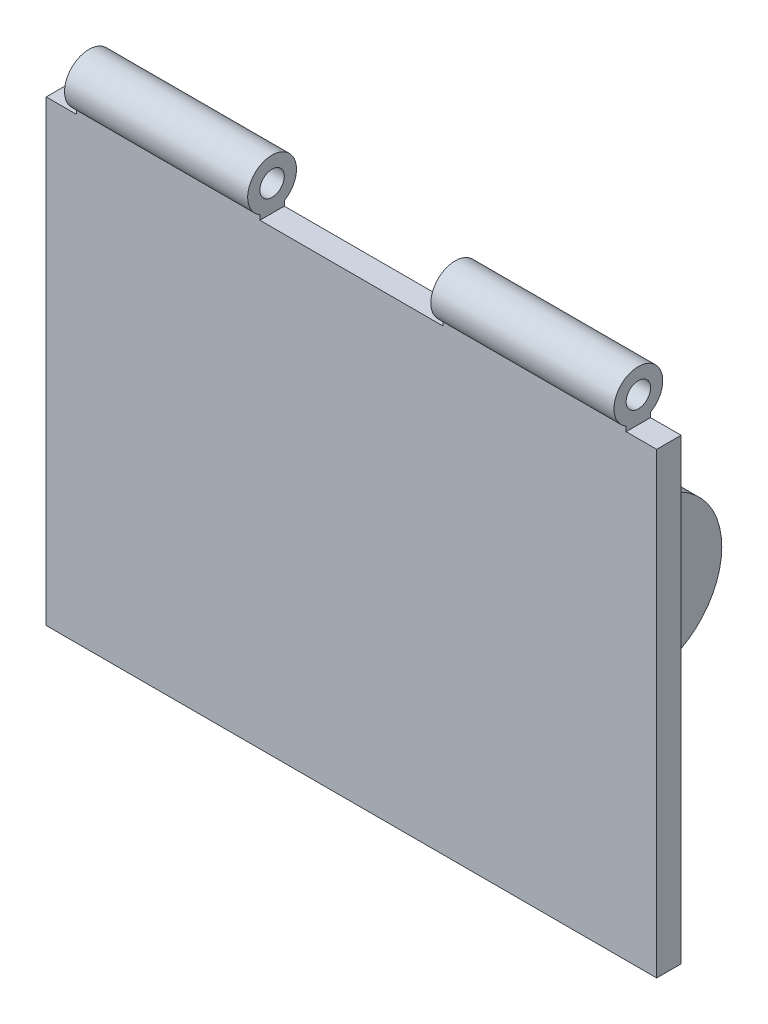
ISO-10303-21;
HEADER;
FILE_DESCRIPTION(('STEP AP214'),'2;1');
FILE_NAME('part.step','',(''),(''),'','','');
FILE_SCHEMA(('AUTOMOTIVE_DESIGN { 1 0 10303 214 1 1 1 1 }'));
ENDSEC;
DATA;
#1=APPLICATION_CONTEXT('core data for automotive mechanical design processes');
#2=APPLICATION_PROTOCOL_DEFINITION('international standard','automotive_design',2000,#1);
#3=PRODUCT_CONTEXT('',#1,'mechanical');
#4=PRODUCT('Part','Part','',(#3));
#5=PRODUCT_RELATED_PRODUCT_CATEGORY('part','',(#4));
#6=PRODUCT_DEFINITION_FORMATION('','',#4);
#7=PRODUCT_DEFINITION_CONTEXT('part definition',#1,'design');
#8=PRODUCT_DEFINITION('design','',#6,#7);
#9=PRODUCT_DEFINITION_SHAPE('','',#8);
#10=(LENGTH_UNIT() NAMED_UNIT(*) SI_UNIT(.MILLI.,.METRE.));
#11=(NAMED_UNIT(*) PLANE_ANGLE_UNIT() SI_UNIT($,.RADIAN.));
#12=(NAMED_UNIT(*) SI_UNIT($,.STERADIAN.) SOLID_ANGLE_UNIT());
#13=UNCERTAINTY_MEASURE_WITH_UNIT(LENGTH_MEASURE(1.E-05),#10,'distance_accuracy_value','');
#14=(GEOMETRIC_REPRESENTATION_CONTEXT(3) GLOBAL_UNCERTAINTY_ASSIGNED_CONTEXT((#13)) GLOBAL_UNIT_ASSIGNED_CONTEXT((#10,
#11,#12)) REPRESENTATION_CONTEXT('',''));
#15=CARTESIAN_POINT('',(0.,0.,0.));
#16=DIRECTION('',(0.,0.,1.));
#17=DIRECTION('',(1.,0.,0.));
#18=AXIS2_PLACEMENT_3D('',#15,#16,#17);
#19=CARTESIAN_POINT('',(-50.,37.5,4.));
#20=DIRECTION('',(0.,-1.,0.));
#21=DIRECTION('',(0.,0.,-1.));
#22=AXIS2_PLACEMENT_3D('',#19,#20,#21);
#23=PLANE('',#22);
#24=DIRECTION('',(0.,0.,-1.));
#25=VECTOR('',#24,1.);
#26=CARTESIAN_POINT('',(-15.,37.5,4.));
#27=LINE('',#26,#25);
#28=CARTESIAN_POINT('',(-15.,37.5,4.));
#29=VERTEX_POINT('',#28);
#30=CARTESIAN_POINT('',(-15.,37.5,0.));
#31=VERTEX_POINT('',#30);
#32=EDGE_CURVE('E206',#29,#31,#27,.T.);
#33=ORIENTED_EDGE('',*,*,#32,.F.);
#34=DIRECTION('',(-1.,0.,0.));
#35=VECTOR('',#34,1.);
#36=CARTESIAN_POINT('',(-50.,37.5,4.));
#37=LINE('',#36,#35);
#38=CARTESIAN_POINT('',(15.,37.5,4.));
#39=VERTEX_POINT('',#38);
#40=EDGE_CURVE('E249',#39,#29,#37,.T.);
#41=ORIENTED_EDGE('',*,*,#40,.F.);
#42=DIRECTION('',(0.,0.,1.));
#43=VECTOR('',#42,1.);
#44=CARTESIAN_POINT('',(15.,37.5,4.));
#45=LINE('',#44,#43);
#46=CARTESIAN_POINT('',(15.,37.5,0.));
#47=VERTEX_POINT('',#46);
#48=EDGE_CURVE('E237',#47,#39,#45,.T.);
#49=ORIENTED_EDGE('',*,*,#48,.F.);
#50=DIRECTION('',(-1.,0.,0.));
#51=VECTOR('',#50,1.);
#52=CARTESIAN_POINT('',(-50.,37.5,0.));
#53=LINE('',#52,#51);
#54=EDGE_CURVE('E261',#47,#31,#53,.T.);
#55=ORIENTED_EDGE('',*,*,#54,.T.);
#56=EDGE_LOOP('',(#33,#41,#49,#55));
#57=FACE_BOUND('',#56,.T.);
#58=ADVANCED_FACE('F38',(#57),#23,.F.);
#59=CARTESIAN_POINT('',(-45.,37.5,4.));
#60=VERTEX_POINT('',#59);
#61=CARTESIAN_POINT('',(-50.,37.5,4.));
#62=VERTEX_POINT('',#61);
#63=EDGE_CURVE('E243',#60,#62,#37,.T.);
#64=ORIENTED_EDGE('',*,*,#63,.F.);
#65=DIRECTION('',(0.,0.,-1.));
#66=VECTOR('',#65,1.);
#67=CARTESIAN_POINT('',(-45.,37.5,4.));
#68=LINE('',#67,#66);
#69=CARTESIAN_POINT('',(-45.,37.5,0.));
#70=VERTEX_POINT('',#69);
#71=EDGE_CURVE('E201',#60,#70,#68,.T.);
#72=ORIENTED_EDGE('',*,*,#71,.T.);
#73=CARTESIAN_POINT('',(-50.,37.5,0.));
#74=VERTEX_POINT('',#73);
#75=EDGE_CURVE('E256',#70,#74,#53,.T.);
#76=ORIENTED_EDGE('',*,*,#75,.T.);
#77=DIRECTION('',(0.,0.,-1.));
#78=VECTOR('',#77,1.);
#79=CARTESIAN_POINT('',(-50.,37.5,4.));
#80=LINE('',#79,#78);
#81=EDGE_CURVE('E270',#62,#74,#80,.T.);
#82=ORIENTED_EDGE('',*,*,#81,.F.);
#83=EDGE_LOOP('',(#64,#72,#76,#82));
#84=FACE_BOUND('',#83,.T.);
#85=ADVANCED_FACE('F323',(#84),#23,.F.);
#86=CARTESIAN_POINT('',(50.,-37.5,4.));
#87=DIRECTION('',(-1.,0.,0.));
#88=DIRECTION('',(0.,0.,1.));
#89=AXIS2_PLACEMENT_3D('',#86,#87,#88);
#90=PLANE('',#89);
#91=DIRECTION('',(0.,1.,0.));
#92=VECTOR('',#91,1.);
#93=CARTESIAN_POINT('',(50.,-37.5,0.));
#94=LINE('',#93,#92);
#95=CARTESIAN_POINT('',(50.,-37.5,0.));
#96=VERTEX_POINT('',#95);
#97=CARTESIAN_POINT('',(50.,37.5,0.));
#98=VERTEX_POINT('',#97);
#99=EDGE_CURVE('E239',#96,#98,#94,.T.);
#100=ORIENTED_EDGE('',*,*,#99,.T.);
#101=DIRECTION('',(0.,0.,-1.));
#102=VECTOR('',#101,1.);
#103=CARTESIAN_POINT('',(50.,37.5,4.));
#104=LINE('',#103,#102);
#105=CARTESIAN_POINT('',(50.,37.5,4.));
#106=VERTEX_POINT('',#105);
#107=EDGE_CURVE('E47',#106,#98,#104,.T.);
#108=ORIENTED_EDGE('',*,*,#107,.F.);
#109=DIRECTION('',(0.,1.,0.));
#110=VECTOR('',#109,1.);
#111=CARTESIAN_POINT('',(50.,-37.5,4.));
#112=LINE('',#111,#110);
#113=CARTESIAN_POINT('',(50.,-37.5,4.));
#114=VERTEX_POINT('',#113);
#115=EDGE_CURVE('E240',#114,#106,#112,.T.);
#116=ORIENTED_EDGE('',*,*,#115,.F.);
#117=DIRECTION('',(0.,0.,-1.));
#118=VECTOR('',#117,1.);
#119=CARTESIAN_POINT('',(50.,-37.5,4.));
#120=LINE('',#119,#118);
#121=EDGE_CURVE('E253',#114,#96,#120,.T.);
#122=ORIENTED_EDGE('',*,*,#121,.T.);
#123=EDGE_LOOP('',(#100,#108,#116,#122));
#124=FACE_BOUND('',#123,.T.);
#125=ADVANCED_FACE('F40',(#124),#90,.F.);
#126=CARTESIAN_POINT('',(45.,37.5,0.));
#127=VERTEX_POINT('',#126);
#128=EDGE_CURVE('E257',#98,#127,#53,.T.);
#129=ORIENTED_EDGE('',*,*,#128,.T.);
#130=DIRECTION('',(0.,0.,1.));
#131=VECTOR('',#130,1.);
#132=CARTESIAN_POINT('',(45.,37.5,4.));
#133=LINE('',#132,#131);
#134=CARTESIAN_POINT('',(45.,37.5,4.));
#135=VERTEX_POINT('',#134);
#136=EDGE_CURVE('E232',#127,#135,#133,.T.);
#137=ORIENTED_EDGE('',*,*,#136,.T.);
#138=EDGE_CURVE('E245',#106,#135,#37,.T.);
#139=ORIENTED_EDGE('',*,*,#138,.F.);
#140=ORIENTED_EDGE('',*,*,#107,.T.);
#141=EDGE_LOOP('',(#129,#137,#139,#140));
#142=FACE_BOUND('',#141,.T.);
#143=ADVANCED_FACE('F276',(#142),#23,.F.);
#144=CARTESIAN_POINT('',(-50.,-37.5,4.));
#145=DIRECTION('',(1.,0.,0.));
#146=DIRECTION('',(0.,0.,-1.));
#147=AXIS2_PLACEMENT_3D('',#144,#145,#146);
#148=PLANE('',#147);
#149=DIRECTION('',(0.,-1.,0.));
#150=VECTOR('',#149,1.);
#151=CARTESIAN_POINT('',(-50.,-37.5,0.));
#152=LINE('',#151,#150);
#153=CARTESIAN_POINT('',(-50.,-37.5,0.));
#154=VERTEX_POINT('',#153);
#155=EDGE_CURVE('E260',#74,#154,#152,.T.);
#156=ORIENTED_EDGE('',*,*,#155,.T.);
#157=DIRECTION('',(0.,0.,-1.));
#158=VECTOR('',#157,1.);
#159=CARTESIAN_POINT('',(-50.,-37.5,4.));
#160=LINE('',#159,#158);
#161=CARTESIAN_POINT('',(-50.,-37.5,4.));
#162=VERTEX_POINT('',#161);
#163=EDGE_CURVE('E267',#162,#154,#160,.T.);
#164=ORIENTED_EDGE('',*,*,#163,.F.);
#165=DIRECTION('',(0.,-1.,0.));
#166=VECTOR('',#165,1.);
#167=CARTESIAN_POINT('',(-50.,-37.5,4.));
#168=LINE('',#167,#166);
#169=EDGE_CURVE('E248',#62,#162,#168,.T.);
#170=ORIENTED_EDGE('',*,*,#169,.F.);
#171=ORIENTED_EDGE('',*,*,#81,.T.);
#172=EDGE_LOOP('',(#156,#164,#170,#171));
#173=FACE_BOUND('',#172,.T.);
#174=ADVANCED_FACE('F332',(#173),#148,.F.);
#175=CARTESIAN_POINT('',(-50.,-37.5,4.));
#176=DIRECTION('',(0.,1.,0.));
#177=DIRECTION('',(0.,0.,1.));
#178=AXIS2_PLACEMENT_3D('',#175,#176,#177);
#179=PLANE('',#178);
#180=DIRECTION('',(0.,0.,1.));
#181=VECTOR('',#180,1.);
#182=CARTESIAN_POINT('',(6.665,-37.5,0.));
#183=LINE('',#182,#181);
#184=CARTESIAN_POINT('',(6.665,-37.5,-38.9193708176068));
#185=VERTEX_POINT('',#184);
#186=CARTESIAN_POINT('',(6.665,-37.5,0.));
#187=VERTEX_POINT('',#186);
#188=EDGE_CURVE('E160',#185,#187,#183,.T.);
#189=ORIENTED_EDGE('',*,*,#188,.T.);
#190=DIRECTION('',(1.,0.,0.));
#191=VECTOR('',#190,1.);
#192=CARTESIAN_POINT('',(-50.,-37.5,0.));
#193=LINE('',#192,#191);
#194=EDGE_CURVE('E263',#187,#96,#193,.T.);
#195=ORIENTED_EDGE('',*,*,#194,.T.);
#196=ORIENTED_EDGE('',*,*,#121,.F.);
#197=DIRECTION('',(1.,0.,0.));
#198=VECTOR('',#197,1.);
#199=CARTESIAN_POINT('',(-50.,-37.5,4.));
#200=LINE('',#199,#198);
#201=EDGE_CURVE('E251',#162,#114,#200,.T.);
#202=ORIENTED_EDGE('',*,*,#201,.F.);
#203=ORIENTED_EDGE('',*,*,#163,.T.);
#204=CARTESIAN_POINT('',(-6.665,-37.5,0.));
#205=VERTEX_POINT('',#204);
#206=EDGE_CURVE('E244',#154,#205,#193,.T.);
#207=ORIENTED_EDGE('',*,*,#206,.T.);
#208=DIRECTION('',(0.,0.,1.));
#209=VECTOR('',#208,1.);
#210=CARTESIAN_POINT('',(-6.665,-37.5,0.));
#211=LINE('',#210,#209);
#212=CARTESIAN_POINT('',(-6.665,-37.5,-38.9193708176069));
#213=VERTEX_POINT('',#212);
#214=EDGE_CURVE('E163',#213,#205,#211,.T.);
#215=ORIENTED_EDGE('',*,*,#214,.F.);
#216=DIRECTION('',(1.,0.,0.));
#217=VECTOR('',#216,1.);
#218=CARTESIAN_POINT('',(-194.154368416072,-37.5,-38.9193708176069));
#219=LINE('',#218,#217);
#220=EDGE_CURVE('E152',#213,#185,#219,.T.);
#221=ORIENTED_EDGE('',*,*,#220,.T.);
#222=EDGE_LOOP('',(#189,#195,#196,#202,#203,#207,#215,#221));
#223=FACE_BOUND('',#222,.T.);
#224=ADVANCED_FACE('F159',(#223),#179,.F.);
#225=CARTESIAN_POINT('',(0.,0.,4.));
#226=DIRECTION('',(0.,0.,-1.));
#227=DIRECTION('',(-1.,0.,0.));
#228=AXIS2_PLACEMENT_3D('',#225,#226,#227);
#229=PLANE('',#228);
#230=ORIENTED_EDGE('',*,*,#40,.T.);
#231=DIRECTION('',(0.,-1.,0.));
#232=VECTOR('',#231,1.);
#233=CARTESIAN_POINT('',(-15.,38.2858983848622,4.));
#234=LINE('',#233,#232);
#235=CARTESIAN_POINT('',(-15.,38.2858983848622,4.));
#236=VERTEX_POINT('',#235);
#237=EDGE_CURVE('E186',#236,#29,#234,.T.);
#238=ORIENTED_EDGE('',*,*,#237,.F.);
#239=DIRECTION('',(-1.,0.,0.));
#240=VECTOR('',#239,1.);
#241=CARTESIAN_POINT('',(-15.,38.2858983848622,4.));
#242=LINE('',#241,#240);
#243=CARTESIAN_POINT('',(-45.,38.2858983848622,4.));
#244=VERTEX_POINT('',#243);
#245=EDGE_CURVE('E193',#236,#244,#242,.T.);
#246=ORIENTED_EDGE('',*,*,#245,.T.);
#247=DIRECTION('',(0.,-1.,0.));
#248=VECTOR('',#247,1.);
#249=CARTESIAN_POINT('',(-45.,38.2858983848622,4.));
#250=LINE('',#249,#248);
#251=EDGE_CURVE('E183',#244,#60,#250,.T.);
#252=ORIENTED_EDGE('',*,*,#251,.T.);
#253=ORIENTED_EDGE('',*,*,#63,.T.);
#254=ORIENTED_EDGE('',*,*,#169,.T.);
#255=ORIENTED_EDGE('',*,*,#201,.T.);
#256=ORIENTED_EDGE('',*,*,#115,.T.);
#257=ORIENTED_EDGE('',*,*,#138,.T.);
#258=DIRECTION('',(0.,-1.,0.));
#259=VECTOR('',#258,1.);
#260=CARTESIAN_POINT('',(45.,38.2858983848622,4.));
#261=LINE('',#260,#259);
#262=CARTESIAN_POINT('',(45.,38.2858983848622,4.));
#263=VERTEX_POINT('',#262);
#264=EDGE_CURVE('E218',#263,#135,#261,.T.);
#265=ORIENTED_EDGE('',*,*,#264,.F.);
#266=DIRECTION('',(1.,0.,0.));
#267=VECTOR('',#266,1.);
#268=CARTESIAN_POINT('',(15.,38.2858983848622,4.));
#269=LINE('',#268,#267);
#270=CARTESIAN_POINT('',(15.,38.2858983848622,4.));
#271=VERTEX_POINT('',#270);
#272=EDGE_CURVE('E230',#271,#263,#269,.T.);
#273=ORIENTED_EDGE('',*,*,#272,.F.);
#274=DIRECTION('',(0.,-1.,0.));
#275=VECTOR('',#274,1.);
#276=CARTESIAN_POINT('',(15.,38.2858983848622,4.));
#277=LINE('',#276,#275);
#278=EDGE_CURVE('E221',#271,#39,#277,.T.);
#279=ORIENTED_EDGE('',*,*,#278,.T.);
#280=EDGE_LOOP('',(#230,#238,#246,#252,#253,#254,#255,#256,#257,#265,#273,#279));
#281=FACE_BOUND('',#280,.T.);
#282=ADVANCED_FACE('F292',(#281),#229,.F.);
#283=CARTESIAN_POINT('',(0.,0.,0.));
#284=DIRECTION('',(0.,0.,-1.));
#285=DIRECTION('',(-1.,0.,0.));
#286=AXIS2_PLACEMENT_3D('',#283,#284,#285);
#287=PLANE('',#286);
#288=DIRECTION('',(0.,1.,0.));
#289=VECTOR('',#288,1.);
#290=CARTESIAN_POINT('',(-6.665,-37.5,0.));
#291=LINE('',#290,#289);
#292=CARTESIAN_POINT('',(-6.665,-12.5,0.));
#293=VERTEX_POINT('',#292);
#294=EDGE_CURVE('E170',#205,#293,#291,.T.);
#295=ORIENTED_EDGE('',*,*,#294,.F.);
#296=ORIENTED_EDGE('',*,*,#206,.F.);
#297=ORIENTED_EDGE('',*,*,#155,.F.);
#298=ORIENTED_EDGE('',*,*,#75,.F.);
#299=DIRECTION('',(0.,1.,0.));
#300=VECTOR('',#299,1.);
#301=CARTESIAN_POINT('',(-45.,37.4284686587032,0.));
#302=LINE('',#301,#300);
#303=CARTESIAN_POINT('',(-45.,38.2858983848622,0.));
#304=VERTEX_POINT('',#303);
#305=EDGE_CURVE('E189',#70,#304,#302,.T.);
#306=ORIENTED_EDGE('',*,*,#305,.T.);
#307=DIRECTION('',(-1.,0.,0.));
#308=VECTOR('',#307,1.);
#309=CARTESIAN_POINT('',(-15.,38.2858983848622,0.));
#310=LINE('',#309,#308);
#311=CARTESIAN_POINT('',(-15.,38.2858983848622,0.));
#312=VERTEX_POINT('',#311);
#313=EDGE_CURVE('E198',#312,#304,#310,.T.);
#314=ORIENTED_EDGE('',*,*,#313,.F.);
#315=DIRECTION('',(0.,1.,0.));
#316=VECTOR('',#315,1.);
#317=CARTESIAN_POINT('',(-15.,37.4284686587032,0.));
#318=LINE('',#317,#316);
#319=EDGE_CURVE('E191',#31,#312,#318,.T.);
#320=ORIENTED_EDGE('',*,*,#319,.F.);
#321=ORIENTED_EDGE('',*,*,#54,.F.);
#322=DIRECTION('',(0.,1.,0.));
#323=VECTOR('',#322,1.);
#324=CARTESIAN_POINT('',(15.,37.4284686587032,0.));
#325=LINE('',#324,#323);
#326=CARTESIAN_POINT('',(15.,38.2858983848622,0.));
#327=VERTEX_POINT('',#326);
#328=EDGE_CURVE('E215',#47,#327,#325,.T.);
#329=ORIENTED_EDGE('',*,*,#328,.T.);
#330=DIRECTION('',(1.,0.,0.));
#331=VECTOR('',#330,1.);
#332=CARTESIAN_POINT('',(15.,38.2858983848622,0.));
#333=LINE('',#332,#331);
#334=CARTESIAN_POINT('',(45.,38.2858983848622,0.));
#335=VERTEX_POINT('',#334);
#336=EDGE_CURVE('E224',#327,#335,#333,.T.);
#337=ORIENTED_EDGE('',*,*,#336,.T.);
#338=DIRECTION('',(0.,1.,0.));
#339=VECTOR('',#338,1.);
#340=CARTESIAN_POINT('',(45.,37.4284686587032,0.));
#341=LINE('',#340,#339);
#342=EDGE_CURVE('E212',#127,#335,#341,.T.);
#343=ORIENTED_EDGE('',*,*,#342,.F.);
#344=ORIENTED_EDGE('',*,*,#128,.F.);
#345=ORIENTED_EDGE('',*,*,#99,.F.);
#346=ORIENTED_EDGE('',*,*,#194,.F.);
#347=DIRECTION('',(0.,1.,0.));
#348=VECTOR('',#347,1.);
#349=CARTESIAN_POINT('',(6.665,-37.5,0.));
#350=LINE('',#349,#348);
#351=CARTESIAN_POINT('',(6.665,-12.5,0.));
#352=VERTEX_POINT('',#351);
#353=EDGE_CURVE('E168',#187,#352,#350,.T.);
#354=ORIENTED_EDGE('',*,*,#353,.T.);
#355=DIRECTION('',(1.,0.,0.));
#356=VECTOR('',#355,1.);
#357=CARTESIAN_POINT('',(-6.665,-12.5,0.));
#358=LINE('',#357,#356);
#359=EDGE_CURVE('E59',#293,#352,#358,.T.);
#360=ORIENTED_EDGE('',*,*,#359,.F.);
#361=EDGE_LOOP('',(#295,#296,#297,#298,#306,#314,#320,#321,#329,#337,#343,#344,#345,#346,#354,#360));
#362=FACE_BOUND('',#361,.T.);
#363=ADVANCED_FACE('F283',(#362),#287,.T.);
#364=CARTESIAN_POINT('',(15.,41.75,2.));
#365=DIRECTION('',(1.,0.,0.));
#366=DIRECTION('',(0.,0.,-1.));
#367=AXIS2_PLACEMENT_3D('',#364,#365,#366);
#368=PLANE('',#367);
#369=CARTESIAN_POINT('',(15.,41.75,2.));
#370=DIRECTION('',(1.,0.,0.));
#371=DIRECTION('',(0.,0.,-1.));
#372=AXIS2_PLACEMENT_3D('',#369,#370,#371);
#373=CIRCLE('',#372,2.);
#374=CARTESIAN_POINT('',(15.,41.75,0.));
#375=VERTEX_POINT('',#374);
#376=EDGE_CURVE('E209',#375,#375,#373,.T.);
#377=ORIENTED_EDGE('',*,*,#376,.T.);
#378=EDGE_LOOP('',(#377));
#379=FACE_BOUND('',#378,.T.);
#380=ORIENTED_EDGE('',*,*,#328,.F.);
#381=ORIENTED_EDGE('',*,*,#48,.T.);
#382=ORIENTED_EDGE('',*,*,#278,.F.);
#383=CARTESIAN_POINT('',(15.,41.75,2.));
#384=DIRECTION('',(1.,0.,0.));
#385=DIRECTION('',(0.,0.,-1.));
#386=AXIS2_PLACEMENT_3D('',#383,#384,#385);
#387=CIRCLE('',#386,4.);
#388=EDGE_CURVE('E217',#327,#271,#387,.T.);
#389=ORIENTED_EDGE('',*,*,#388,.F.);
#390=EDGE_LOOP('',(#380,#381,#382,#389));
#391=FACE_BOUND('',#390,.T.);
#392=ADVANCED_FACE('F363',(#379,#391),#368,.F.);
#393=CARTESIAN_POINT('',(45.,41.75,2.));
#394=DIRECTION('',(1.,0.,0.));
#395=DIRECTION('',(0.,0.,-1.));
#396=AXIS2_PLACEMENT_3D('',#393,#394,#395);
#397=PLANE('',#396);
#398=CARTESIAN_POINT('',(45.,41.75,2.));
#399=DIRECTION('',(1.,0.,0.));
#400=DIRECTION('',(0.,0.,-1.));
#401=AXIS2_PLACEMENT_3D('',#398,#399,#400);
#402=CIRCLE('',#401,2.);
#403=CARTESIAN_POINT('',(45.,41.75,0.));
#404=VERTEX_POINT('',#403);
#405=EDGE_CURVE('E208',#404,#404,#402,.T.);
#406=ORIENTED_EDGE('',*,*,#405,.F.);
#407=EDGE_LOOP('',(#406));
#408=FACE_BOUND('',#407,.T.);
#409=ORIENTED_EDGE('',*,*,#136,.F.);
#410=ORIENTED_EDGE('',*,*,#342,.T.);
#411=CARTESIAN_POINT('',(45.,41.75,2.));
#412=DIRECTION('',(1.,0.,0.));
#413=DIRECTION('',(0.,0.,-1.));
#414=AXIS2_PLACEMENT_3D('',#411,#412,#413);
#415=CIRCLE('',#414,4.);
#416=EDGE_CURVE('E226',#335,#263,#415,.T.);
#417=ORIENTED_EDGE('',*,*,#416,.T.);
#418=ORIENTED_EDGE('',*,*,#264,.T.);
#419=EDGE_LOOP('',(#409,#410,#417,#418));
#420=FACE_BOUND('',#419,.T.);
#421=ADVANCED_FACE('F288',(#408,#420),#397,.T.);
#422=CARTESIAN_POINT('',(15.,41.75,2.));
#423=DIRECTION('',(1.,0.,0.));
#424=DIRECTION('',(0.,0.,-1.));
#425=AXIS2_PLACEMENT_3D('',#422,#423,#424);
#426=CYLINDRICAL_SURFACE('',#425,4.);
#427=ORIENTED_EDGE('',*,*,#416,.F.);
#428=ORIENTED_EDGE('',*,*,#336,.F.);
#429=ORIENTED_EDGE('',*,*,#388,.T.);
#430=ORIENTED_EDGE('',*,*,#272,.T.);
#431=EDGE_LOOP('',(#427,#428,#429,#430));
#432=FACE_BOUND('',#431,.T.);
#433=ADVANCED_FACE('F379',(#432),#426,.T.);
#434=CARTESIAN_POINT('',(15.,41.75,2.));
#435=DIRECTION('',(1.,0.,0.));
#436=DIRECTION('',(0.,0.,-1.));
#437=AXIS2_PLACEMENT_3D('',#434,#435,#436);
#438=CYLINDRICAL_SURFACE('',#437,2.);
#439=ORIENTED_EDGE('',*,*,#376,.F.);
#440=EDGE_LOOP('',(#439));
#441=FACE_BOUND('',#440,.T.);
#442=ORIENTED_EDGE('',*,*,#405,.T.);
#443=EDGE_LOOP('',(#442));
#444=FACE_BOUND('',#443,.T.);
#445=ADVANCED_FACE('F390',(#441,#444),#438,.F.);
#446=CARTESIAN_POINT('',(-15.,41.75,2.));
#447=DIRECTION('',(-1.,0.,0.));
#448=DIRECTION('',(0.,0.,-1.));
#449=AXIS2_PLACEMENT_3D('',#446,#447,#448);
#450=PLANE('',#449);
#451=CARTESIAN_POINT('',(-15.,41.75,2.));
#452=DIRECTION('',(1.,0.,0.));
#453=DIRECTION('',(0.,0.,-1.));
#454=AXIS2_PLACEMENT_3D('',#451,#452,#453);
#455=CIRCLE('',#454,2.);
#456=CARTESIAN_POINT('',(-15.,41.75,0.));
#457=VERTEX_POINT('',#456);
#458=EDGE_CURVE('E180',#457,#457,#455,.T.);
#459=ORIENTED_EDGE('',*,*,#458,.F.);
#460=EDGE_LOOP('',(#459));
#461=FACE_BOUND('',#460,.T.);
#462=ORIENTED_EDGE('',*,*,#237,.T.);
#463=ORIENTED_EDGE('',*,*,#32,.T.);
#464=ORIENTED_EDGE('',*,*,#319,.T.);
#465=CARTESIAN_POINT('',(-15.,41.75,2.));
#466=DIRECTION('',(1.,0.,0.));
#467=DIRECTION('',(0.,0.,-1.));
#468=AXIS2_PLACEMENT_3D('',#465,#466,#467);
#469=CIRCLE('',#468,4.);
#470=EDGE_CURVE('E188',#312,#236,#469,.T.);
#471=ORIENTED_EDGE('',*,*,#470,.T.);
#472=EDGE_LOOP('',(#462,#463,#464,#471));
#473=FACE_BOUND('',#472,.T.);
#474=ADVANCED_FACE('F400',(#461,#473),#450,.F.);
#475=CARTESIAN_POINT('',(-45.,41.75,2.));
#476=DIRECTION('',(-1.,0.,0.));
#477=DIRECTION('',(0.,0.,-1.));
#478=AXIS2_PLACEMENT_3D('',#475,#476,#477);
#479=PLANE('',#478);
#480=CARTESIAN_POINT('',(-45.,41.75,2.));
#481=DIRECTION('',(1.,0.,0.));
#482=DIRECTION('',(0.,0.,-1.));
#483=AXIS2_PLACEMENT_3D('',#480,#481,#482);
#484=CIRCLE('',#483,2.);
#485=CARTESIAN_POINT('',(-45.,41.75,0.));
#486=VERTEX_POINT('',#485);
#487=EDGE_CURVE('E179',#486,#486,#484,.T.);
#488=ORIENTED_EDGE('',*,*,#487,.T.);
#489=EDGE_LOOP('',(#488));
#490=FACE_BOUND('',#489,.T.);
#491=ORIENTED_EDGE('',*,*,#71,.F.);
#492=ORIENTED_EDGE('',*,*,#251,.F.);
#493=CARTESIAN_POINT('',(-45.,41.75,2.));
#494=DIRECTION('',(1.,0.,0.));
#495=DIRECTION('',(0.,0.,-1.));
#496=AXIS2_PLACEMENT_3D('',#493,#494,#495);
#497=CIRCLE('',#496,4.);
#498=EDGE_CURVE('E195',#304,#244,#497,.T.);
#499=ORIENTED_EDGE('',*,*,#498,.F.);
#500=ORIENTED_EDGE('',*,*,#305,.F.);
#501=EDGE_LOOP('',(#491,#492,#499,#500));
#502=FACE_BOUND('',#501,.T.);
#503=ADVANCED_FACE('F437',(#490,#502),#479,.T.);
#504=CARTESIAN_POINT('',(-15.,41.75,2.));
#505=DIRECTION('',(-1.,0.,0.));
#506=DIRECTION('',(0.,0.,1.));
#507=AXIS2_PLACEMENT_3D('',#504,#505,#506);
#508=CYLINDRICAL_SURFACE('',#507,4.);
#509=ORIENTED_EDGE('',*,*,#498,.T.);
#510=ORIENTED_EDGE('',*,*,#245,.F.);
#511=ORIENTED_EDGE('',*,*,#470,.F.);
#512=ORIENTED_EDGE('',*,*,#313,.T.);
#513=EDGE_LOOP('',(#509,#510,#511,#512));
#514=FACE_BOUND('',#513,.T.);
#515=ADVANCED_FACE('F446',(#514),#508,.T.);
#516=CARTESIAN_POINT('',(-15.,41.75,2.));
#517=DIRECTION('',(-1.,0.,0.));
#518=DIRECTION('',(0.,0.,1.));
#519=AXIS2_PLACEMENT_3D('',#516,#517,#518);
#520=CYLINDRICAL_SURFACE('',#519,2.);
#521=ORIENTED_EDGE('',*,*,#458,.T.);
#522=EDGE_LOOP('',(#521));
#523=FACE_BOUND('',#522,.T.);
#524=ORIENTED_EDGE('',*,*,#487,.F.);
#525=EDGE_LOOP('',(#524));
#526=FACE_BOUND('',#525,.T.);
#527=ADVANCED_FACE('F455',(#523,#526),#520,.F.);
#528=CARTESIAN_POINT('',(-6.665,-12.5,0.));
#529=DIRECTION('',(0.,-1.,0.));
#530=DIRECTION('',(0.,0.,-1.));
#531=AXIS2_PLACEMENT_3D('',#528,#529,#530);
#532=PLANE('',#531);
#533=DIRECTION('',(0.,0.,-1.));
#534=VECTOR('',#533,1.);
#535=CARTESIAN_POINT('',(6.665,-12.5,0.));
#536=LINE('',#535,#534);
#537=CARTESIAN_POINT('',(6.665,-12.5,-38.9059941316755));
#538=VERTEX_POINT('',#537);
#539=EDGE_CURVE('E54',#352,#538,#536,.T.);
#540=ORIENTED_EDGE('',*,*,#539,.T.);
#541=DIRECTION('',(1.,0.,0.));
#542=VECTOR('',#541,1.);
#543=CARTESIAN_POINT('',(-194.154368416072,-12.5,-38.9059941316755));
#544=LINE('',#543,#542);
#545=CARTESIAN_POINT('',(-6.665,-12.5,-38.9059941316755));
#546=VERTEX_POINT('',#545);
#547=EDGE_CURVE('E154',#538,#546,#544,.F.);
#548=ORIENTED_EDGE('',*,*,#547,.T.);
#549=DIRECTION('',(0.,0.,-1.));
#550=VECTOR('',#549,1.);
#551=CARTESIAN_POINT('',(-6.665,-12.5,0.));
#552=LINE('',#551,#550);
#553=EDGE_CURVE('E173',#293,#546,#552,.T.);
#554=ORIENTED_EDGE('',*,*,#553,.F.);
#555=ORIENTED_EDGE('',*,*,#359,.T.);
#556=EDGE_LOOP('',(#540,#548,#554,#555));
#557=FACE_BOUND('',#556,.T.);
#558=ADVANCED_FACE('F464',(#557),#532,.F.);
#559=CARTESIAN_POINT('',(-6.665,0.,0.));
#560=DIRECTION('',(-1.,0.,0.));
#561=DIRECTION('',(0.,0.,1.));
#562=AXIS2_PLACEMENT_3D('',#559,#560,#561);
#563=PLANE('',#562);
#564=CARTESIAN_POINT('',(-6.665,-25.0008040364607,-37.41));
#565=DIRECTION('',(-1.,0.,0.));
#566=DIRECTION('',(0.,0.,1.));
#567=AXIS2_PLACEMENT_3D('',#564,#565,#566);
#568=CIRCLE('',#567,4.2);
#569=CARTESIAN_POINT('',(-6.665,-25.0008040364607,-33.21));
#570=VERTEX_POINT('',#569);
#571=EDGE_CURVE('E307',#570,#570,#568,.T.);
#572=ORIENTED_EDGE('',*,*,#571,.F.);
#573=EDGE_LOOP('',(#572));
#574=FACE_BOUND('',#573,.T.);
#575=CARTESIAN_POINT('',(-6.665,-25.0008040364607,-37.41));
#576=DIRECTION('',(-1.,0.,0.));
#577=DIRECTION('',(0.,0.,1.));
#578=AXIS2_PLACEMENT_3D('',#575,#576,#577);
#579=CIRCLE('',#578,12.59);
#580=EDGE_CURVE('E164',#213,#546,#579,.F.);
#581=ORIENTED_EDGE('',*,*,#580,.F.);
#582=ORIENTED_EDGE('',*,*,#214,.T.);
#583=ORIENTED_EDGE('',*,*,#294,.T.);
#584=ORIENTED_EDGE('',*,*,#553,.T.);
#585=EDGE_LOOP('',(#581,#582,#583,#584));
#586=FACE_BOUND('',#585,.T.);
#587=ADVANCED_FACE('F301',(#574,#586),#563,.T.);
#588=CARTESIAN_POINT('',(6.665,0.,0.));
#589=DIRECTION('',(-1.,0.,0.));
#590=DIRECTION('',(0.,0.,1.));
#591=AXIS2_PLACEMENT_3D('',#588,#589,#590);
#592=PLANE('',#591);
#593=CARTESIAN_POINT('',(6.665,-25.0008040364607,-37.41));
#594=DIRECTION('',(-1.,0.,0.));
#595=DIRECTION('',(0.,0.,1.));
#596=AXIS2_PLACEMENT_3D('',#593,#594,#595);
#597=CIRCLE('',#596,4.2);
#598=CARTESIAN_POINT('',(6.665,-25.0008040364607,-33.21));
#599=VERTEX_POINT('',#598);
#600=EDGE_CURVE('E42',#599,#599,#597,.T.);
#601=ORIENTED_EDGE('',*,*,#600,.T.);
#602=EDGE_LOOP('',(#601));
#603=FACE_BOUND('',#602,.T.);
#604=ORIENTED_EDGE('',*,*,#188,.F.);
#605=CARTESIAN_POINT('',(6.665,-25.0008040364607,-37.41));
#606=DIRECTION('',(-1.,0.,0.));
#607=DIRECTION('',(0.,0.,1.));
#608=AXIS2_PLACEMENT_3D('',#605,#606,#607);
#609=CIRCLE('',#608,12.59);
#610=EDGE_CURVE('E11',#185,#538,#609,.F.);
#611=ORIENTED_EDGE('',*,*,#610,.T.);
#612=ORIENTED_EDGE('',*,*,#539,.F.);
#613=ORIENTED_EDGE('',*,*,#353,.F.);
#614=EDGE_LOOP('',(#604,#611,#612,#613));
#615=FACE_BOUND('',#614,.T.);
#616=ADVANCED_FACE('F166',(#603,#615),#592,.F.);
#617=CARTESIAN_POINT('',(-194.154368416072,-25.0008040364607,-37.41));
#618=DIRECTION('',(1.,0.,0.));
#619=DIRECTION('',(0.,0.,-1.));
#620=AXIS2_PLACEMENT_3D('',#617,#618,#619);
#621=CYLINDRICAL_SURFACE('',#620,12.59);
#622=ORIENTED_EDGE('',*,*,#580,.T.);
#623=ORIENTED_EDGE('',*,*,#547,.F.);
#624=ORIENTED_EDGE('',*,*,#610,.F.);
#625=ORIENTED_EDGE('',*,*,#220,.F.);
#626=EDGE_LOOP('',(#622,#623,#624,#625));
#627=FACE_BOUND('',#626,.T.);
#628=ADVANCED_FACE('F151',(#627),#621,.T.);
#629=CARTESIAN_POINT('',(50.,-25.0008040364607,-37.41));
#630=DIRECTION('',(-1.,0.,0.));
#631=DIRECTION('',(0.,0.,1.));
#632=AXIS2_PLACEMENT_3D('',#629,#630,#631);
#633=CYLINDRICAL_SURFACE('',#632,4.2);
#634=ORIENTED_EDGE('',*,*,#571,.T.);
#635=EDGE_LOOP('',(#634));
#636=FACE_BOUND('',#635,.T.);
#637=ORIENTED_EDGE('',*,*,#600,.F.);
#638=EDGE_LOOP('',(#637));
#639=FACE_BOUND('',#638,.T.);
#640=ADVANCED_FACE('F315',(#636,#639),#633,.F.);
#641=CLOSED_SHELL('',(#58,#85,#125,#143,#174,#224,#282,#363,#392,#421,#433,#445,#474,#503,#515,
#527,#558,#587,#616,#628,#640));
#642=MANIFOLD_SOLID_BREP('B2',#641);
#643=ADVANCED_BREP_SHAPE_REPRESENTATION('',(#18,#642),#14);
#644=SHAPE_DEFINITION_REPRESENTATION(#9,#643);
ENDSEC;
END-ISO-10303-21;
